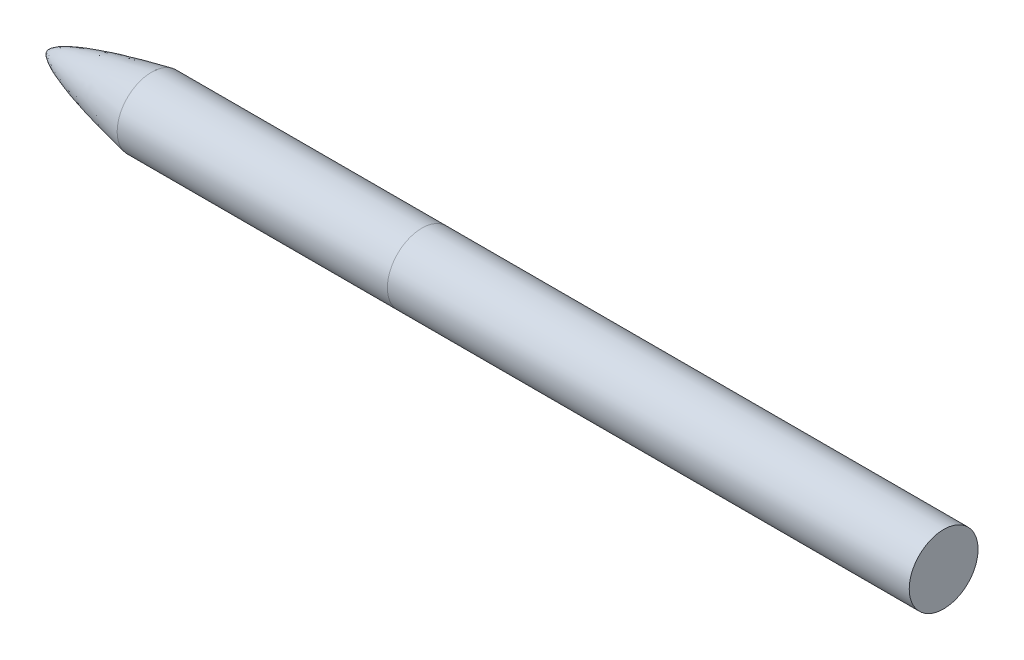
ISO-10303-21;
HEADER;
FILE_DESCRIPTION(('STEP AP214'),'2;1');
FILE_NAME('part.step','',(''),(''),'','','');
FILE_SCHEMA(('AUTOMOTIVE_DESIGN { 1 0 10303 214 1 1 1 1 }'));
ENDSEC;
DATA;
#1=APPLICATION_CONTEXT('core data for automotive mechanical design processes');
#2=APPLICATION_PROTOCOL_DEFINITION('international standard','automotive_design',2000,#1);
#3=PRODUCT_CONTEXT('',#1,'mechanical');
#4=PRODUCT('Part','Part','',(#3));
#5=PRODUCT_RELATED_PRODUCT_CATEGORY('part','',(#4));
#6=PRODUCT_DEFINITION_FORMATION('','',#4);
#7=PRODUCT_DEFINITION_CONTEXT('part definition',#1,'design');
#8=PRODUCT_DEFINITION('design','',#6,#7);
#9=PRODUCT_DEFINITION_SHAPE('','',#8);
#10=(LENGTH_UNIT() NAMED_UNIT(*) SI_UNIT(.MILLI.,.METRE.));
#11=(NAMED_UNIT(*) PLANE_ANGLE_UNIT() SI_UNIT($,.RADIAN.));
#12=(NAMED_UNIT(*) SI_UNIT($,.STERADIAN.) SOLID_ANGLE_UNIT());
#13=UNCERTAINTY_MEASURE_WITH_UNIT(LENGTH_MEASURE(1.E-05),#10,'distance_accuracy_value','');
#14=(GEOMETRIC_REPRESENTATION_CONTEXT(3) GLOBAL_UNCERTAINTY_ASSIGNED_CONTEXT((#13)) GLOBAL_UNIT_ASSIGNED_CONTEXT((#10,
#11,#12)) REPRESENTATION_CONTEXT('',''));
#15=CARTESIAN_POINT('',(0.,0.,0.));
#16=DIRECTION('',(0.,0.,1.));
#17=DIRECTION('',(1.,0.,0.));
#18=AXIS2_PLACEMENT_3D('',#15,#16,#17);
#19=CARTESIAN_POINT('',(68222.68985,0.,0.));
#20=DIRECTION('',(-1.,0.,0.));
#21=DIRECTION('',(0.,0.,1.));
#22=AXIS2_PLACEMENT_3D('',#19,#20,#21);
#23=PLANE('',#22);
#24=CARTESIAN_POINT('',(68222.68985,0.,0.));
#25=DIRECTION('',(-1.,0.,0.));
#26=DIRECTION('',(0.,0.,1.));
#27=AXIS2_PLACEMENT_3D('',#24,#25,#26);
#28=CIRCLE('',#27,4500.);
#29=CARTESIAN_POINT('',(68222.68985,0.,4500.));
#30=VERTEX_POINT('',#29);
#31=EDGE_CURVE('E11',#30,#30,#28,.T.);
#32=ORIENTED_EDGE('',*,*,#31,.F.);
#33=EDGE_LOOP('',(#32));
#34=FACE_BOUND('',#33,.T.);
#35=ADVANCED_FACE('F53',(#34),#23,.F.);
#36=CARTESIAN_POINT('',(0.,0.,0.));
#37=DIRECTION('',(-1.,0.,0.));
#38=DIRECTION('',(0.,0.,1.));
#39=AXIS2_PLACEMENT_3D('',#36,#37,#38);
#40=CYLINDRICAL_SURFACE('',#39,4500.);
#41=ORIENTED_EDGE('',*,*,#31,.T.);
#42=EDGE_LOOP('',(#41));
#43=FACE_BOUND('',#42,.T.);
#44=CARTESIAN_POINT('',(0.,0.,0.));
#45=DIRECTION('',(-1.,0.,0.));
#46=DIRECTION('',(0.,0.,1.));
#47=AXIS2_PLACEMENT_3D('',#44,#45,#46);
#48=CIRCLE('',#47,4500.);
#49=CARTESIAN_POINT('',(0.,0.,4500.));
#50=VERTEX_POINT('',#49);
#51=EDGE_CURVE('E59',#50,#50,#48,.T.);
#52=ORIENTED_EDGE('',*,*,#51,.F.);
#53=EDGE_LOOP('',(#52));
#54=FACE_BOUND('',#53,.T.);
#55=ADVANCED_FACE('F67',(#43,#54),#40,.T.);
#56=CARTESIAN_POINT('',(0.,0.,0.));
#57=DIRECTION('',(1.,0.,0.));
#58=DIRECTION('',(0.,0.,-1.));
#59=AXIS2_PLACEMENT_3D('',#56,#57,#58);
#60=PLANE('',#59);
#61=ORIENTED_EDGE('',*,*,#51,.T.);
#62=EDGE_LOOP('',(#61));
#63=FACE_BOUND('',#62,.T.);
#64=ADVANCED_FACE('F65',(#63),#60,.F.);
#65=CLOSED_SHELL('',(#35,#55,#64));
#66=MANIFOLD_SOLID_BREP('B2',#65);
#67=CARTESIAN_POINT('',(-48976.3590000009,0.,0.));
#68=CARTESIAN_POINT('',(-48976.3536377998,0.592613518393923,0.));
#69=CARTESIAN_POINT('',(-48976.3339196,1.77753959887836,0.));
#70=CARTESIAN_POINT('',(-48976.2770473191,3.55403389352858,0.));
#71=CARTESIAN_POINT('',(-48976.1513992792,5.92077307612852,0.));
#72=CARTESIAN_POINT('',(-48975.9884150825,8.28519002385435,0.));
#73=CARTESIAN_POINT('',(-48975.7920875691,10.6470109184046,0.));
#74=CARTESIAN_POINT('',(-48975.5077317899,13.5957977291107,0.));
#75=CARTESIAN_POINT('',(-48974.9757806443,18.3059388459622,0.));
#76=CARTESIAN_POINT('',(-48974.0754070479,24.7618553993227,0.));
#77=CARTESIAN_POINT('',(-48972.8120323184,32.0697328763038,0.));
#78=CARTESIAN_POINT('',(-48971.2673958316,39.6341270619227,0.));
#79=CARTESIAN_POINT('',(-48969.406130221,47.7534580339054,0.));
#80=CARTESIAN_POINT('',(-48966.8268876936,57.8338362619774,0.));
#81=CARTESIAN_POINT('',(-48963.0673407283,70.655981623614,0.));
#82=CARTESIAN_POINT('',(-48958.3805228066,84.4983728405303,0.));
#83=CARTESIAN_POINT('',(-48953.2836293473,97.9381849494779,0.));
#84=CARTESIAN_POINT('',(-48948.4575608414,109.652853502967,0.));
#85=CARTESIAN_POINT('',(-48944.0575042516,119.6982248387,0.));
#86=CARTESIAN_POINT('',(-48937.6779730681,133.473896562884,0.));
#87=CARTESIAN_POINT('',(-48929.0051210306,150.825042001414,0.));
#88=CARTESIAN_POINT('',(-48916.7053469109,173.345494974489,0.));
#89=CARTESIAN_POINT('',(-48900.1790562098,200.654871824714,0.));
#90=CARTESIAN_POINT('',(-48873.4135929167,240.921000666003,0.));
#91=CARTESIAN_POINT('',(-48829.8080252334,298.488708543437,0.));
#92=CARTESIAN_POINT('',(-48773.8331343705,361.897558052658,0.));
#93=CARTESIAN_POINT('',(-48705.0882169938,430.131142155553,0.));
#94=CARTESIAN_POINT('',(-48627.5669833674,499.626495881405,0.));
#95=CARTESIAN_POINT('',(-48547.260191937,565.688964914839,0.));
#96=CARTESIAN_POINT('',(-48447.5933231252,641.289222995792,0.));
#97=CARTESIAN_POINT('',(-48327.6166987576,724.844021045156,0.));
#98=CARTESIAN_POINT('',(-48177.5705570114,821.376913095206,0.));
#99=CARTESIAN_POINT('',(-47996.2225003013,928.525753815581,0.));
#100=CARTESIAN_POINT('',(-47813.1604184786,1028.36642565282,0.));
#101=CARTESIAN_POINT('',(-47629.3641264566,1122.25291337215,0.));
#102=CARTESIAN_POINT('',(-47427.7591565449,1220.22667360856,0.));
#103=CARTESIAN_POINT('',(-47218.3886873144,1316.8762436018,0.));
#104=CARTESIAN_POINT('',(-46980.5837416219,1420.97620274693,0.));
#105=CARTESIAN_POINT('',(-46650.0308700184,1558.15872265492,0.));
#106=CARTESIAN_POINT('',(-46262.6490503801,1709.47227868018,0.));
#107=CARTESIAN_POINT('',(-45807.0257017756,1876.28468683039,0.));
#108=CARTESIAN_POINT('',(-45282.5135796323,2056.16202714749,0.));
#109=CARTESIAN_POINT('',(-44755.0328194414,2227.10659013279,0.));
#110=CARTESIAN_POINT('',(-44291.3970082342,2370.05549557149,0.));
#111=CARTESIAN_POINT('',(-43892.7664460181,2488.50104082764,0.));
#112=CARTESIAN_POINT('',(-43559.8543679421,2584.74030449195,0.));
#113=CARTESIAN_POINT('',(-43293.1279736723,2660.34507751095,0.));
#114=CARTESIAN_POINT('',(-42959.2622712207,2753.22066506819,0.));
#115=CARTESIAN_POINT('',(-42557.9458512937,2862.21265182157,0.));
#116=CARTESIAN_POINT('',(-42088.8606946809,2986.07938131542,0.));
#117=CARTESIAN_POINT('',(-41551.7076740953,3123.57683864617,0.));
#118=CARTESIAN_POINT('',(-41080.8854747214,3240.66089391089,0.));
#119=CARTESIAN_POINT('',(-40676.8078541227,3338.91505160537,0.));
#120=CARTESIAN_POINT('',(-40339.7599510459,3419.47749042113,0.));
#121=CARTESIAN_POINT('',(-40069.9417555373,3483.17007419924,0.));
#122=CARTESIAN_POINT('',(-39799.952917419,3546.13528461043,0.));
#123=CARTESIAN_POINT('',(-39529.8019713852,3608.40118907053,0.));
#124=CARTESIAN_POINT('',(-39259.4967967302,3669.99402664388,0.));
#125=CARTESIAN_POINT('',(-38955.2381904833,3738.55646588511,0.));
#126=CARTESIAN_POINT('',(-38684.622602168,3798.77129813441,0.));
#127=CARTESIAN_POINT('',(-38447.7182463473,3850.93588029252,0.));
#128=CARTESIAN_POINT('',(-38244.5782551867,3895.28695309573,0.));
#129=CARTESIAN_POINT('',(-38109.1206436684,3924.71217868145,0.));
#130=CARTESIAN_POINT('',(-37973.6327279334,3953.99760005705,0.));
#131=CARTESIAN_POINT('',(-37838.1151786208,3983.14549348873,0.));
#132=CARTESIAN_POINT('',(-37702.5685684398,4012.15808833422,0.));
#133=CARTESIAN_POINT('',(-37566.9935787017,4041.03752755167,0.));
#134=CARTESIAN_POINT('',(-37431.3906593421,4069.78593818505,0.));
#135=CARTESIAN_POINT('',(-37295.7605916038,4098.40532195293,0.));
#136=CARTESIAN_POINT('',(-37160.1035638964,4126.89774056571,0.));
#137=CARTESIAN_POINT('',(-37024.4206943239,4155.26501652832,0.));
#138=CARTESIAN_POINT('',(-36888.7115275561,4183.5092303958,0.));
#139=CARTESIAN_POINT('',(-36752.9781567893,4211.63190731486,0.));
#140=CARTESIAN_POINT('',(-36617.2184323737,4239.6353622549,0.));
#141=CARTESIAN_POINT('',(-36481.437199134,4267.52047897772,0.));
#142=CARTESIAN_POINT('',(-36345.6274908885,4295.29043150098,0.));
#143=CARTESIAN_POINT('',(-36226.7811405485,4319.48751852697,0.));
#144=CARTESIAN_POINT('',(-36124.8864121755,4340.15977132004,0.));
#145=CARTESIAN_POINT('',(-36039.9839255639,4357.33634380099,0.));
#146=CARTESIAN_POINT('',(-35972.0220353337,4371.05667883883,0.));
#147=CARTESIAN_POINT('',(-35904.1239424555,4384.73578261734,0.));
#148=CARTESIAN_POINT('',(-35836.0973505608,4398.41189279128,0.));
#149=CARTESIAN_POINT('',(-35768.2733802838,4412.01971158097,0.));
#150=CARTESIAN_POINT('',(-35700.0977328239,4425.66907676527,0.));
#151=CARTESIAN_POINT('',(-35632.4912207514,4439.17804353373,0.));
#152=CARTESIAN_POINT('',(-35563.9192091352,4452.85035771208,0.));
#153=CARTESIAN_POINT('',(-35496.9917954048,4466.16992571499,0.));
#154=CARTESIAN_POINT('',(-35435.7411806688,4478.33261594702,0.));
#155=CARTESIAN_POINT('',(-35387.6042210427,4487.87773778611,0.));
#156=CARTESIAN_POINT('',(-35349.7293516114,4495.37617660894,0.));
#157=CARTESIAN_POINT('',(-35334.1182547569,4498.46520235578,0.));
#158=CARTESIAN_POINT('',(-35326.359,4500.,0.));
#159=B_SPLINE_CURVE_WITH_KNOTS('',4,(#67,#68,#69,#70,#71,#72,#73,#74,#75,#76,#77,#78,#79,#80,
#81,#82,#83,#84,#85,#86,#87,#88,#89,#90,#91,#92,#93,#94,#95,#96,#97,#98,#99,#100,#101,#102,#103,
#104,#105,#106,#107,#108,#109,#110,#111,#112,#113,#114,#115,#116,#117,#118,#119,#120,#121,#122,
#123,#124,#125,#126,#127,#128,#129,#130,#131,#132,#133,#134,#135,#136,#137,#138,#139,#140,#141,
#142,#143,#144,#145,#146,#147,#148,#149,#150,#151,#152,#153,#154,#155,#156,#157,#158),
.UNSPECIFIED.,.F.,.F.,(5,1,1,1,1,1,1,1,1,1,1,1,1,1,1,1,1,1,1,1,1,1,1,1,1,1,1,1,1,1,1,1,1,1,1,1,
1,1,1,1,1,1,1,1,1,1,1,1,1,1,1,1,1,1,1,1,1,1,1,1,1,1,1,1,1,1,1,1,1,1,1,1,1,1,1,1,1,1,1,1,1,1,1,1,
1,1,1,1,5),(0.,0.000148328026750839,0.000296656053501679,0.000444984080252518,
0.000593312107003358,0.000741640133754197,0.000889968160505037,0.00118662421400672,
0.00177993632101007,0.00237324842801343,0.00274624307694481,0.00311923772587618,
0.00386522702373893,0.00497784907326906,0.00609047112279918,0.00677681098646097,
0.00746315085012276,0.00814949071378455,0.00883583057744634,0.0105771699004412,
0.0123185092234362,0.0145716207421909,0.0168247322609456,0.0226779316410198,0.0303835955506087,
0.0357220012213423,0.0410604068920758,0.0487350744039489,0.056409741915822,0.067031742840802,
0.077653743765782,0.0933924059274577,0.109131068089133,0.119224978635271,0.129318889181409,
0.149506710273685,0.166858232874773,0.184209755475861,0.218912800678037,0.253615851396531,
0.288318902115024,0.323021951422571,0.357725000730117,0.375076528118665,0.392428055507212,
0.409779582895759,0.427131110284307,0.461834162806843,0.49653721532938,0.531240268124574,
0.565943320919769,0.583294847762235,0.6006463746047,0.617997901447165,0.63534942828963,
0.652700955299119,0.670052482308608,0.687404009318097,0.71343129971819,0.722107063108794,
0.730782826499398,0.739458589890003,0.748134353280607,0.756810116671212,0.765485880061816,
0.77416164345242,0.782837406809899,0.791513170167377,0.800188933524856,0.808864696882334,
0.817540460239813,0.826216223597291,0.83489198695477,0.843567750312248,0.852243513589491,
0.860919276866734,0.865257158505355,0.869595040143977,0.873932921782598,0.87827080342122,
0.882608685059841,0.886946566698463,0.891284448337084,0.895622329975706,0.899960211614327,
0.904298093252949,0.90863597489157,0.910804915710881,0.912973856530192),.UNSPECIFIED.);
#160=CARTESIAN_POINT('',(-35326.359,0.,0.));
#161=DIRECTION('',(-1.,0.,0.));
#162=AXIS1_PLACEMENT('',#160,#161);
#163=SURFACE_OF_REVOLUTION('',#159,#162);
#164=CARTESIAN_POINT('',(-35326.3590000009,0.,0.));
#165=DIRECTION('',(-1.,0.,0.));
#166=DIRECTION('',(0.,0.,1.));
#167=AXIS2_PLACEMENT_3D('',#164,#165,#166);
#168=CIRCLE('',#167,4500.);
#169=CARTESIAN_POINT('',(-35326.3590000009,0.,4500.));
#170=VERTEX_POINT('',#169);
#171=EDGE_CURVE('E104',#170,#170,#168,.T.);
#172=ORIENTED_EDGE('',*,*,#171,.T.);
#173=EDGE_LOOP('',(#172));
#174=FACE_BOUND('',#173,.T.);
#175=CARTESIAN_POINT('',(-48976.3590000009,0.,0.));
#176=VERTEX_POINT('',#175);
#177=VERTEX_LOOP('',#176);
#178=FACE_BOUND('',#177,.T.);
#179=ADVANCED_FACE('F97',(#174,#178),#163,.F.);
#180=CARTESIAN_POINT('',(0.,0.,0.));
#181=DIRECTION('',(1.,0.,0.));
#182=DIRECTION('',(0.,0.,-1.));
#183=AXIS2_PLACEMENT_3D('',#180,#181,#182);
#184=PLANE('',#183);
#185=CARTESIAN_POINT('',(0.,0.,0.));
#186=DIRECTION('',(-1.,0.,0.));
#187=DIRECTION('',(0.,0.,1.));
#188=AXIS2_PLACEMENT_3D('',#185,#186,#187);
#189=CIRCLE('',#188,4500.);
#190=CARTESIAN_POINT('',(0.,0.,4500.));
#191=VERTEX_POINT('',#190);
#192=EDGE_CURVE('E51',#191,#191,#189,.T.);
#193=ORIENTED_EDGE('',*,*,#192,.F.);
#194=EDGE_LOOP('',(#193));
#195=FACE_BOUND('',#194,.T.);
#196=ADVANCED_FACE('F108',(#195),#184,.T.);
#197=CARTESIAN_POINT('',(-35326.359,0.,0.));
#198=DIRECTION('',(-1.,0.,0.));
#199=DIRECTION('',(0.,0.,1.));
#200=AXIS2_PLACEMENT_3D('',#197,#198,#199);
#201=CYLINDRICAL_SURFACE('',#200,4500.);
#202=ORIENTED_EDGE('',*,*,#192,.T.);
#203=EDGE_LOOP('',(#202));
#204=FACE_BOUND('',#203,.T.);
#205=ORIENTED_EDGE('',*,*,#171,.F.);
#206=EDGE_LOOP('',(#205));
#207=FACE_BOUND('',#206,.T.);
#208=ADVANCED_FACE('F113',(#204,#207),#201,.T.);
#209=CLOSED_SHELL('',(#179,#196,#208));
#210=MANIFOLD_SOLID_BREP('B6',#209);
#211=ADVANCED_BREP_SHAPE_REPRESENTATION('',(#18,#66,#210),#14);
#212=SHAPE_DEFINITION_REPRESENTATION(#9,#211);
ENDSEC;
END-ISO-10303-21;
